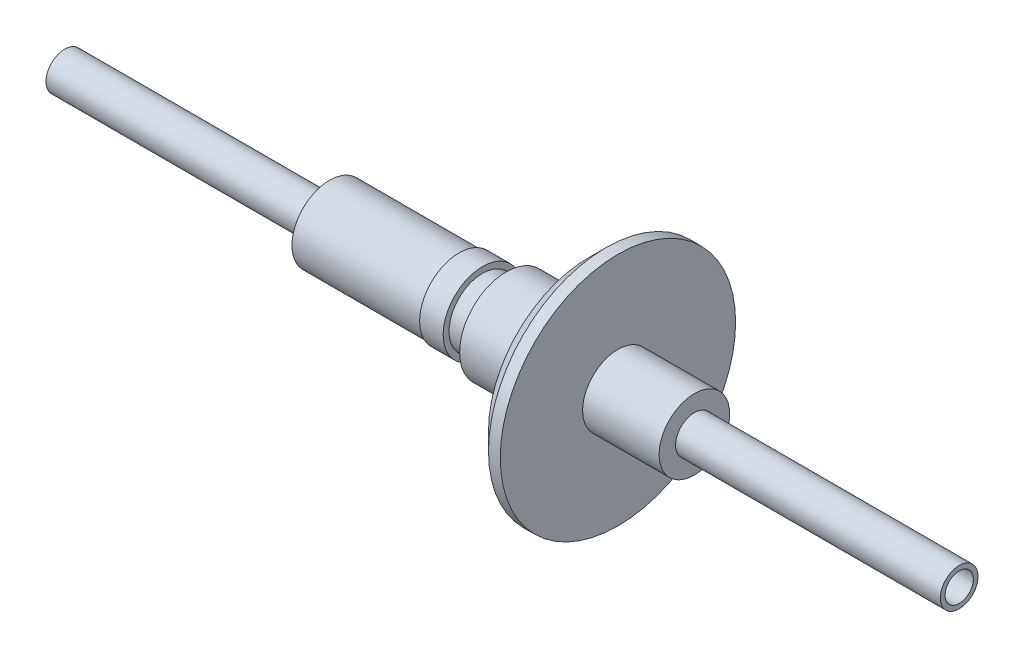
ISO-10303-21;
HEADER;
FILE_DESCRIPTION(('STEP AP214'),'2;1');
FILE_NAME('part.step','',(''),(''),'','','');
FILE_SCHEMA(('AUTOMOTIVE_DESIGN { 1 0 10303 214 1 1 1 1 }'));
ENDSEC;
DATA;
#1=APPLICATION_CONTEXT('core data for automotive mechanical design processes');
#2=APPLICATION_PROTOCOL_DEFINITION('international standard','automotive_design',2000,#1);
#3=PRODUCT_CONTEXT('',#1,'mechanical');
#4=PRODUCT('Part','Part','',(#3));
#5=PRODUCT_RELATED_PRODUCT_CATEGORY('part','',(#4));
#6=PRODUCT_DEFINITION_FORMATION('','',#4);
#7=PRODUCT_DEFINITION_CONTEXT('part definition',#1,'design');
#8=PRODUCT_DEFINITION('design','',#6,#7);
#9=PRODUCT_DEFINITION_SHAPE('','',#8);
#10=(LENGTH_UNIT() NAMED_UNIT(*) SI_UNIT(.MILLI.,.METRE.));
#11=(NAMED_UNIT(*) PLANE_ANGLE_UNIT() SI_UNIT($,.RADIAN.));
#12=(NAMED_UNIT(*) SI_UNIT($,.STERADIAN.) SOLID_ANGLE_UNIT());
#13=UNCERTAINTY_MEASURE_WITH_UNIT(LENGTH_MEASURE(1.E-05),#10,'distance_accuracy_value','');
#14=(GEOMETRIC_REPRESENTATION_CONTEXT(3) GLOBAL_UNCERTAINTY_ASSIGNED_CONTEXT((#13)) GLOBAL_UNIT_ASSIGNED_CONTEXT((#10,
#11,#12)) REPRESENTATION_CONTEXT('',''));
#15=CARTESIAN_POINT('',(0.,0.,0.));
#16=DIRECTION('',(0.,0.,1.));
#17=DIRECTION('',(1.,0.,0.));
#18=AXIS2_PLACEMENT_3D('',#15,#16,#17);
#19=CARTESIAN_POINT('',(-94.,3.2,0.));
#20=DIRECTION('',(1.,0.,0.));
#21=DIRECTION('',(0.,0.,-1.));
#22=AXIS2_PLACEMENT_3D('',#19,#20,#21);
#23=PLANE('',#22);
#24=CARTESIAN_POINT('',(-94.,0.,0.));
#25=DIRECTION('',(-1.,0.,0.));
#26=DIRECTION('',(0.,0.,1.));
#27=AXIS2_PLACEMENT_3D('',#24,#25,#26);
#28=CIRCLE('',#27,2.4);
#29=CARTESIAN_POINT('',(-94.,0.,2.4));
#30=VERTEX_POINT('',#29);
#31=EDGE_CURVE('E10',#30,#30,#28,.T.);
#32=ORIENTED_EDGE('',*,*,#31,.F.);
#33=EDGE_LOOP('',(#32));
#34=FACE_BOUND('',#33,.T.);
#35=CARTESIAN_POINT('',(-94.,0.,0.));
#36=DIRECTION('',(-1.,0.,0.));
#37=DIRECTION('',(0.,0.,1.));
#38=AXIS2_PLACEMENT_3D('',#35,#36,#37);
#39=CIRCLE('',#38,3.2);
#40=CARTESIAN_POINT('',(-94.,0.,3.2));
#41=VERTEX_POINT('',#40);
#42=EDGE_CURVE('E116',#41,#41,#39,.T.);
#43=ORIENTED_EDGE('',*,*,#42,.T.);
#44=EDGE_LOOP('',(#43));
#45=FACE_BOUND('',#44,.T.);
#46=ADVANCED_FACE('F37',(#34,#45),#23,.F.);
#47=CARTESIAN_POINT('',(-110.,0.,0.));
#48=DIRECTION('',(-1.,0.,0.));
#49=DIRECTION('',(0.,0.,1.));
#50=AXIS2_PLACEMENT_3D('',#47,#48,#49);
#51=CYLINDRICAL_SURFACE('',#50,2.4);
#52=CARTESIAN_POINT('',(58.,0.,0.));
#53=DIRECTION('',(-1.,0.,0.));
#54=DIRECTION('',(0.,0.,1.));
#55=AXIS2_PLACEMENT_3D('',#52,#53,#54);
#56=CIRCLE('',#55,2.4);
#57=CARTESIAN_POINT('',(58.,0.,2.4));
#58=VERTEX_POINT('',#57);
#59=EDGE_CURVE('E44',#58,#58,#56,.T.);
#60=ORIENTED_EDGE('',*,*,#59,.F.);
#61=EDGE_LOOP('',(#60));
#62=FACE_BOUND('',#61,.T.);
#63=ORIENTED_EDGE('',*,*,#31,.T.);
#64=EDGE_LOOP('',(#63));
#65=FACE_BOUND('',#64,.T.);
#66=ADVANCED_FACE('F220',(#62,#65),#51,.F.);
#67=CARTESIAN_POINT('',(58.,2.4,0.));
#68=DIRECTION('',(-1.,0.,0.));
#69=DIRECTION('',(0.,0.,1.));
#70=AXIS2_PLACEMENT_3D('',#67,#68,#69);
#71=PLANE('',#70);
#72=CARTESIAN_POINT('',(58.,0.,0.));
#73=DIRECTION('',(-1.,0.,0.));
#74=DIRECTION('',(0.,0.,1.));
#75=AXIS2_PLACEMENT_3D('',#72,#73,#74);
#76=CIRCLE('',#75,3.2);
#77=CARTESIAN_POINT('',(58.,0.,3.2));
#78=VERTEX_POINT('',#77);
#79=EDGE_CURVE('E49',#78,#78,#76,.T.);
#80=ORIENTED_EDGE('',*,*,#79,.F.);
#81=EDGE_LOOP('',(#80));
#82=FACE_BOUND('',#81,.T.);
#83=ORIENTED_EDGE('',*,*,#59,.T.);
#84=EDGE_LOOP('',(#83));
#85=FACE_BOUND('',#84,.T.);
#86=ADVANCED_FACE('F215',(#82,#85),#71,.F.);
#87=CARTESIAN_POINT('',(-110.,0.,0.));
#88=DIRECTION('',(-1.,0.,0.));
#89=DIRECTION('',(0.,0.,1.));
#90=AXIS2_PLACEMENT_3D('',#87,#88,#89);
#91=CYLINDRICAL_SURFACE('',#90,3.2);
#92=CARTESIAN_POINT('',(13.,0.,0.));
#93=DIRECTION('',(-1.,0.,0.));
#94=DIRECTION('',(0.,0.,1.));
#95=AXIS2_PLACEMENT_3D('',#92,#93,#94);
#96=CIRCLE('',#95,3.2);
#97=CARTESIAN_POINT('',(13.,0.,3.2));
#98=VERTEX_POINT('',#97);
#99=EDGE_CURVE('E54',#98,#98,#96,.T.);
#100=ORIENTED_EDGE('',*,*,#99,.F.);
#101=EDGE_LOOP('',(#100));
#102=FACE_BOUND('',#101,.T.);
#103=ORIENTED_EDGE('',*,*,#79,.T.);
#104=EDGE_LOOP('',(#103));
#105=FACE_BOUND('',#104,.T.);
#106=ADVANCED_FACE('F209',(#102,#105),#91,.T.);
#107=CARTESIAN_POINT('',(13.,3.2,0.));
#108=DIRECTION('',(-1.,0.,0.));
#109=DIRECTION('',(0.,0.,1.));
#110=AXIS2_PLACEMENT_3D('',#107,#108,#109);
#111=PLANE('',#110);
#112=CARTESIAN_POINT('',(13.,0.,0.));
#113=DIRECTION('',(-1.,0.,0.));
#114=DIRECTION('',(0.,0.,1.));
#115=AXIS2_PLACEMENT_3D('',#112,#113,#114);
#116=CIRCLE('',#115,6.);
#117=CARTESIAN_POINT('',(13.,0.,6.));
#118=VERTEX_POINT('',#117);
#119=EDGE_CURVE('E60',#118,#118,#116,.T.);
#120=ORIENTED_EDGE('',*,*,#119,.F.);
#121=EDGE_LOOP('',(#120));
#122=FACE_BOUND('',#121,.T.);
#123=ORIENTED_EDGE('',*,*,#99,.T.);
#124=EDGE_LOOP('',(#123));
#125=FACE_BOUND('',#124,.T.);
#126=ADVANCED_FACE('F203',(#122,#125),#111,.F.);
#127=CARTESIAN_POINT('',(-110.,0.,0.));
#128=DIRECTION('',(-1.,0.,0.));
#129=DIRECTION('',(0.,0.,1.));
#130=AXIS2_PLACEMENT_3D('',#127,#128,#129);
#131=CYLINDRICAL_SURFACE('',#130,6.);
#132=CARTESIAN_POINT('',(0.,0.,0.));
#133=DIRECTION('',(-1.,0.,0.));
#134=DIRECTION('',(0.,0.,1.));
#135=AXIS2_PLACEMENT_3D('',#132,#133,#134);
#136=CIRCLE('',#135,6.);
#137=CARTESIAN_POINT('',(0.,0.,6.));
#138=VERTEX_POINT('',#137);
#139=EDGE_CURVE('E64',#138,#138,#136,.T.);
#140=ORIENTED_EDGE('',*,*,#139,.F.);
#141=EDGE_LOOP('',(#140));
#142=FACE_BOUND('',#141,.T.);
#143=ORIENTED_EDGE('',*,*,#119,.T.);
#144=EDGE_LOOP('',(#143));
#145=FACE_BOUND('',#144,.T.);
#146=ADVANCED_FACE('F197',(#142,#145),#131,.T.);
#147=CARTESIAN_POINT('',(0.,6.,0.));
#148=DIRECTION('',(-1.,0.,0.));
#149=DIRECTION('',(0.,0.,1.));
#150=AXIS2_PLACEMENT_3D('',#147,#148,#149);
#151=PLANE('',#150);
#152=CARTESIAN_POINT('',(0.,0.,0.));
#153=DIRECTION('',(-1.,0.,0.));
#154=DIRECTION('',(0.,0.,1.));
#155=AXIS2_PLACEMENT_3D('',#152,#153,#154);
#156=CIRCLE('',#155,20.);
#157=CARTESIAN_POINT('',(0.,0.,20.));
#158=VERTEX_POINT('',#157);
#159=EDGE_CURVE('E68',#158,#158,#156,.T.);
#160=ORIENTED_EDGE('',*,*,#159,.F.);
#161=EDGE_LOOP('',(#160));
#162=FACE_BOUND('',#161,.T.);
#163=ORIENTED_EDGE('',*,*,#139,.T.);
#164=EDGE_LOOP('',(#163));
#165=FACE_BOUND('',#164,.T.);
#166=ADVANCED_FACE('F191',(#162,#165),#151,.F.);
#167=CARTESIAN_POINT('',(-110.,0.,0.));
#168=DIRECTION('',(-1.,0.,0.));
#169=DIRECTION('',(0.,0.,1.));
#170=AXIS2_PLACEMENT_3D('',#167,#168,#169);
#171=CYLINDRICAL_SURFACE('',#170,20.);
#172=CARTESIAN_POINT('',(-2.,0.,0.));
#173=DIRECTION('',(-1.,0.,0.));
#174=DIRECTION('',(0.,0.,1.));
#175=AXIS2_PLACEMENT_3D('',#172,#173,#174);
#176=CIRCLE('',#175,20.);
#177=CARTESIAN_POINT('',(-2.,0.,20.));
#178=VERTEX_POINT('',#177);
#179=EDGE_CURVE('E72',#178,#178,#176,.T.);
#180=ORIENTED_EDGE('',*,*,#179,.F.);
#181=EDGE_LOOP('',(#180));
#182=FACE_BOUND('',#181,.T.);
#183=ORIENTED_EDGE('',*,*,#159,.T.);
#184=EDGE_LOOP('',(#183));
#185=FACE_BOUND('',#184,.T.);
#186=ADVANCED_FACE('F185',(#182,#185),#171,.T.);
#187=CARTESIAN_POINT('',(-2.,0.,0.));
#188=DIRECTION('',(1.,0.,0.));
#189=DIRECTION('',(0.,0.,-1.));
#190=AXIS2_PLACEMENT_3D('',#187,#188,#189);
#191=CONICAL_SURFACE('',#190,20.,0.785398163397448);
#192=CARTESIAN_POINT('',(-5.,0.,0.));
#193=DIRECTION('',(-1.,0.,0.));
#194=DIRECTION('',(0.,0.,1.));
#195=AXIS2_PLACEMENT_3D('',#192,#193,#194);
#196=CIRCLE('',#195,17.);
#197=CARTESIAN_POINT('',(-5.,0.,17.));
#198=VERTEX_POINT('',#197);
#199=EDGE_CURVE('E76',#198,#198,#196,.T.);
#200=ORIENTED_EDGE('',*,*,#199,.F.);
#201=EDGE_LOOP('',(#200));
#202=FACE_BOUND('',#201,.T.);
#203=ORIENTED_EDGE('',*,*,#179,.T.);
#204=EDGE_LOOP('',(#203));
#205=FACE_BOUND('',#204,.T.);
#206=ADVANCED_FACE('F179',(#202,#205),#191,.T.);
#207=CARTESIAN_POINT('',(-5.,17.,0.));
#208=DIRECTION('',(1.,0.,0.));
#209=DIRECTION('',(0.,0.,-1.));
#210=AXIS2_PLACEMENT_3D('',#207,#208,#209);
#211=PLANE('',#210);
#212=CARTESIAN_POINT('',(-5.,0.,0.));
#213=DIRECTION('',(-1.,0.,0.));
#214=DIRECTION('',(0.,0.,1.));
#215=AXIS2_PLACEMENT_3D('',#212,#213,#214);
#216=CIRCLE('',#215,7.9);
#217=CARTESIAN_POINT('',(-5.,0.,7.9));
#218=VERTEX_POINT('',#217);
#219=EDGE_CURVE('E80',#218,#218,#216,.T.);
#220=ORIENTED_EDGE('',*,*,#219,.F.);
#221=EDGE_LOOP('',(#220));
#222=FACE_BOUND('',#221,.T.);
#223=ORIENTED_EDGE('',*,*,#199,.T.);
#224=EDGE_LOOP('',(#223));
#225=FACE_BOUND('',#224,.T.);
#226=ADVANCED_FACE('F173',(#222,#225),#211,.F.);
#227=CARTESIAN_POINT('',(-110.,0.,0.));
#228=DIRECTION('',(-1.,0.,0.));
#229=DIRECTION('',(0.,0.,1.));
#230=AXIS2_PLACEMENT_3D('',#227,#228,#229);
#231=CYLINDRICAL_SURFACE('',#230,7.9);
#232=CARTESIAN_POINT('',(-19.,0.,0.));
#233=DIRECTION('',(-1.,0.,0.));
#234=DIRECTION('',(0.,0.,1.));
#235=AXIS2_PLACEMENT_3D('',#232,#233,#234);
#236=CIRCLE('',#235,7.9);
#237=CARTESIAN_POINT('',(-19.,0.,7.9));
#238=VERTEX_POINT('',#237);
#239=EDGE_CURVE('E84',#238,#238,#236,.T.);
#240=ORIENTED_EDGE('',*,*,#239,.F.);
#241=EDGE_LOOP('',(#240));
#242=FACE_BOUND('',#241,.T.);
#243=ORIENTED_EDGE('',*,*,#219,.T.);
#244=EDGE_LOOP('',(#243));
#245=FACE_BOUND('',#244,.T.);
#246=ADVANCED_FACE('F167',(#242,#245),#231,.T.);
#247=CARTESIAN_POINT('',(-19.,7.9,0.));
#248=DIRECTION('',(1.,0.,0.));
#249=DIRECTION('',(0.,0.,-1.));
#250=AXIS2_PLACEMENT_3D('',#247,#248,#249);
#251=PLANE('',#250);
#252=CARTESIAN_POINT('',(-19.,0.,0.));
#253=DIRECTION('',(-1.,0.,0.));
#254=DIRECTION('',(0.,0.,1.));
#255=AXIS2_PLACEMENT_3D('',#252,#253,#254);
#256=CIRCLE('',#255,5.7);
#257=CARTESIAN_POINT('',(-19.,0.,5.7));
#258=VERTEX_POINT('',#257);
#259=EDGE_CURVE('E88',#258,#258,#256,.T.);
#260=ORIENTED_EDGE('',*,*,#259,.F.);
#261=EDGE_LOOP('',(#260));
#262=FACE_BOUND('',#261,.T.);
#263=ORIENTED_EDGE('',*,*,#239,.T.);
#264=EDGE_LOOP('',(#263));
#265=FACE_BOUND('',#264,.T.);
#266=ADVANCED_FACE('F161',(#262,#265),#251,.F.);
#267=CARTESIAN_POINT('',(-110.,0.,0.));
#268=DIRECTION('',(-1.,0.,0.));
#269=DIRECTION('',(0.,0.,1.));
#270=AXIS2_PLACEMENT_3D('',#267,#268,#269);
#271=CYLINDRICAL_SURFACE('',#270,5.7);
#272=CARTESIAN_POINT('',(-23.,0.,0.));
#273=DIRECTION('',(-1.,0.,0.));
#274=DIRECTION('',(0.,0.,1.));
#275=AXIS2_PLACEMENT_3D('',#272,#273,#274);
#276=CIRCLE('',#275,5.7);
#277=CARTESIAN_POINT('',(-23.,0.,5.7));
#278=VERTEX_POINT('',#277);
#279=EDGE_CURVE('E92',#278,#278,#276,.T.);
#280=ORIENTED_EDGE('',*,*,#279,.F.);
#281=EDGE_LOOP('',(#280));
#282=FACE_BOUND('',#281,.T.);
#283=ORIENTED_EDGE('',*,*,#259,.T.);
#284=EDGE_LOOP('',(#283));
#285=FACE_BOUND('',#284,.T.);
#286=ADVANCED_FACE('F155',(#282,#285),#271,.T.);
#287=CARTESIAN_POINT('',(-23.,5.7,0.));
#288=DIRECTION('',(-1.,0.,0.));
#289=DIRECTION('',(0.,0.,1.));
#290=AXIS2_PLACEMENT_3D('',#287,#288,#289);
#291=PLANE('',#290);
#292=CARTESIAN_POINT('',(-23.,0.,0.));
#293=DIRECTION('',(-1.,0.,0.));
#294=DIRECTION('',(0.,0.,1.));
#295=AXIS2_PLACEMENT_3D('',#292,#293,#294);
#296=CIRCLE('',#295,6.7);
#297=CARTESIAN_POINT('',(-23.,0.,6.7));
#298=VERTEX_POINT('',#297);
#299=EDGE_CURVE('E96',#298,#298,#296,.T.);
#300=ORIENTED_EDGE('',*,*,#299,.F.);
#301=EDGE_LOOP('',(#300));
#302=FACE_BOUND('',#301,.T.);
#303=ORIENTED_EDGE('',*,*,#279,.T.);
#304=EDGE_LOOP('',(#303));
#305=FACE_BOUND('',#304,.T.);
#306=ADVANCED_FACE('F149',(#302,#305),#291,.F.);
#307=CARTESIAN_POINT('',(-110.,0.,0.));
#308=DIRECTION('',(-1.,0.,0.));
#309=DIRECTION('',(0.,0.,1.));
#310=AXIS2_PLACEMENT_3D('',#307,#308,#309);
#311=CYLINDRICAL_SURFACE('',#310,6.7);
#312=CARTESIAN_POINT('',(-27.,0.,0.));
#313=DIRECTION('',(-1.,0.,0.));
#314=DIRECTION('',(0.,0.,1.));
#315=AXIS2_PLACEMENT_3D('',#312,#313,#314);
#316=CIRCLE('',#315,6.7);
#317=CARTESIAN_POINT('',(-27.,0.,6.7));
#318=VERTEX_POINT('',#317);
#319=EDGE_CURVE('E100',#318,#318,#316,.T.);
#320=ORIENTED_EDGE('',*,*,#319,.F.);
#321=EDGE_LOOP('',(#320));
#322=FACE_BOUND('',#321,.T.);
#323=ORIENTED_EDGE('',*,*,#299,.T.);
#324=EDGE_LOOP('',(#323));
#325=FACE_BOUND('',#324,.T.);
#326=ADVANCED_FACE('F143',(#322,#325),#311,.T.);
#327=CARTESIAN_POINT('',(-27.,6.7,0.));
#328=DIRECTION('',(1.,0.,0.));
#329=DIRECTION('',(0.,0.,-1.));
#330=AXIS2_PLACEMENT_3D('',#327,#328,#329);
#331=PLANE('',#330);
#332=CARTESIAN_POINT('',(-27.,0.,0.));
#333=DIRECTION('',(-1.,0.,0.));
#334=DIRECTION('',(0.,0.,1.));
#335=AXIS2_PLACEMENT_3D('',#332,#333,#334);
#336=CIRCLE('',#335,6.4);
#337=CARTESIAN_POINT('',(-27.,0.,6.4));
#338=VERTEX_POINT('',#337);
#339=EDGE_CURVE('E104',#338,#338,#336,.T.);
#340=ORIENTED_EDGE('',*,*,#339,.F.);
#341=EDGE_LOOP('',(#340));
#342=FACE_BOUND('',#341,.T.);
#343=ORIENTED_EDGE('',*,*,#319,.T.);
#344=EDGE_LOOP('',(#343));
#345=FACE_BOUND('',#344,.T.);
#346=ADVANCED_FACE('F137',(#342,#345),#331,.F.);
#347=CARTESIAN_POINT('',(-110.,0.,0.));
#348=DIRECTION('',(-1.,0.,0.));
#349=DIRECTION('',(0.,0.,1.));
#350=AXIS2_PLACEMENT_3D('',#347,#348,#349);
#351=CYLINDRICAL_SURFACE('',#350,6.4);
#352=CARTESIAN_POINT('',(-49.,0.,0.));
#353=DIRECTION('',(-1.,0.,0.));
#354=DIRECTION('',(0.,0.,1.));
#355=AXIS2_PLACEMENT_3D('',#352,#353,#354);
#356=CIRCLE('',#355,6.4);
#357=CARTESIAN_POINT('',(-49.,0.,6.4));
#358=VERTEX_POINT('',#357);
#359=EDGE_CURVE('E108',#358,#358,#356,.T.);
#360=ORIENTED_EDGE('',*,*,#359,.F.);
#361=EDGE_LOOP('',(#360));
#362=FACE_BOUND('',#361,.T.);
#363=ORIENTED_EDGE('',*,*,#339,.T.);
#364=EDGE_LOOP('',(#363));
#365=FACE_BOUND('',#364,.T.);
#366=ADVANCED_FACE('F131',(#362,#365),#351,.T.);
#367=CARTESIAN_POINT('',(-49.,6.4,0.));
#368=DIRECTION('',(1.,0.,0.));
#369=DIRECTION('',(0.,0.,-1.));
#370=AXIS2_PLACEMENT_3D('',#367,#368,#369);
#371=PLANE('',#370);
#372=CARTESIAN_POINT('',(-49.,0.,0.));
#373=DIRECTION('',(-1.,0.,0.));
#374=DIRECTION('',(0.,0.,1.));
#375=AXIS2_PLACEMENT_3D('',#372,#373,#374);
#376=CIRCLE('',#375,3.2);
#377=CARTESIAN_POINT('',(-49.,0.,3.2));
#378=VERTEX_POINT('',#377);
#379=EDGE_CURVE('E112',#378,#378,#376,.T.);
#380=ORIENTED_EDGE('',*,*,#379,.F.);
#381=EDGE_LOOP('',(#380));
#382=FACE_BOUND('',#381,.T.);
#383=ORIENTED_EDGE('',*,*,#359,.T.);
#384=EDGE_LOOP('',(#383));
#385=FACE_BOUND('',#384,.T.);
#386=ADVANCED_FACE('F125',(#382,#385),#371,.F.);
#387=CARTESIAN_POINT('',(-110.,0.,0.));
#388=DIRECTION('',(-1.,0.,0.));
#389=DIRECTION('',(0.,0.,1.));
#390=AXIS2_PLACEMENT_3D('',#387,#388,#389);
#391=CYLINDRICAL_SURFACE('',#390,3.2);
#392=ORIENTED_EDGE('',*,*,#42,.F.);
#393=EDGE_LOOP('',(#392));
#394=FACE_BOUND('',#393,.T.);
#395=ORIENTED_EDGE('',*,*,#379,.T.);
#396=EDGE_LOOP('',(#395));
#397=FACE_BOUND('',#396,.T.);
#398=ADVANCED_FACE('F122',(#394,#397),#391,.T.);
#399=CLOSED_SHELL('',(#46,#66,#86,#106,#126,#146,#166,#186,#206,#226,#246,#266,#286,#306,#326,
#346,#366,#386,#398));
#400=MANIFOLD_SOLID_BREP('B2',#399);
#401=ADVANCED_BREP_SHAPE_REPRESENTATION('',(#18,#400),#14);
#402=SHAPE_DEFINITION_REPRESENTATION(#9,#401);
ENDSEC;
END-ISO-10303-21;
